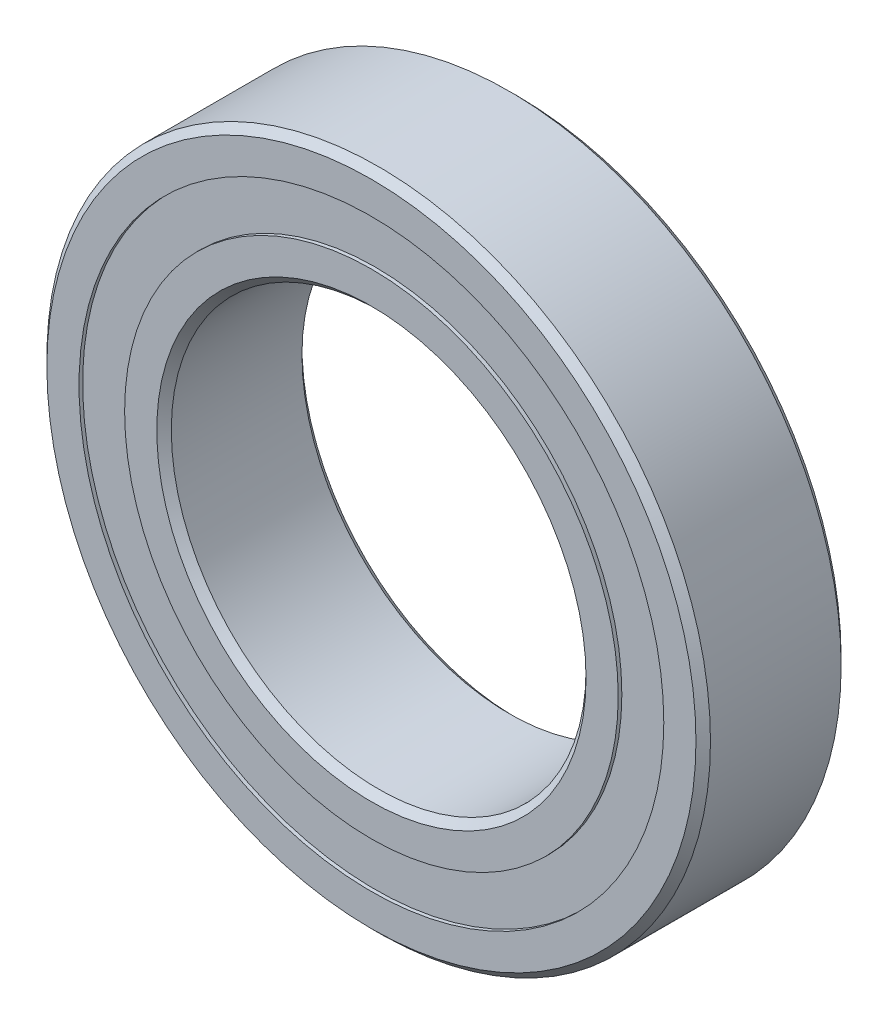
ISO-10303-21;
HEADER;
FILE_DESCRIPTION(('STEP AP214'),'2;1');
FILE_NAME('part.step','',(''),(''),'','','');
FILE_SCHEMA(('AUTOMOTIVE_DESIGN { 1 0 10303 214 1 1 1 1 }'));
ENDSEC;
DATA;
#1=APPLICATION_CONTEXT('core data for automotive mechanical design processes');
#2=APPLICATION_PROTOCOL_DEFINITION('international standard','automotive_design',2000,#1);
#3=PRODUCT_CONTEXT('',#1,'mechanical');
#4=PRODUCT('Part','Part','',(#3));
#5=PRODUCT_RELATED_PRODUCT_CATEGORY('part','',(#4));
#6=PRODUCT_DEFINITION_FORMATION('','',#4);
#7=PRODUCT_DEFINITION_CONTEXT('part definition',#1,'design');
#8=PRODUCT_DEFINITION('design','',#6,#7);
#9=PRODUCT_DEFINITION_SHAPE('','',#8);
#10=(LENGTH_UNIT() NAMED_UNIT(*) SI_UNIT(.MILLI.,.METRE.));
#11=(NAMED_UNIT(*) PLANE_ANGLE_UNIT() SI_UNIT($,.RADIAN.));
#12=(NAMED_UNIT(*) SI_UNIT($,.STERADIAN.) SOLID_ANGLE_UNIT());
#13=UNCERTAINTY_MEASURE_WITH_UNIT(LENGTH_MEASURE(1.E-05),#10,'distance_accuracy_value','');
#14=(GEOMETRIC_REPRESENTATION_CONTEXT(3) GLOBAL_UNCERTAINTY_ASSIGNED_CONTEXT((#13)) GLOBAL_UNIT_ASSIGNED_CONTEXT((#10,
#11,#12)) REPRESENTATION_CONTEXT('',''));
#15=CARTESIAN_POINT('',(0.,0.,0.));
#16=DIRECTION('',(0.,0.,1.));
#17=DIRECTION('',(1.,0.,0.));
#18=AXIS2_PLACEMENT_3D('',#15,#16,#17);
#19=CARTESIAN_POINT('',(0.,14.0989010989011,-3.325));
#20=DIRECTION('',(0.,0.,1.));
#21=DIRECTION('',(1.,0.,0.));
#22=AXIS2_PLACEMENT_3D('',#19,#20,#21);
#23=PLANE('',#22);
#24=CARTESIAN_POINT('',(0.,0.,-3.325));
#25=DIRECTION('',(0.,0.,1.));
#26=DIRECTION('',(1.,0.,0.));
#27=AXIS2_PLACEMENT_3D('',#24,#25,#26);
#28=CIRCLE('',#27,14.0989010989011);
#29=CARTESIAN_POINT('',(14.0989010989011,0.,-3.325));
#30=VERTEX_POINT('',#29);
#31=EDGE_CURVE('E59',#30,#30,#28,.T.);
#32=ORIENTED_EDGE('',*,*,#31,.F.);
#33=EDGE_LOOP('',(#32));
#34=FACE_BOUND('',#33,.T.);
#35=CARTESIAN_POINT('',(0.,0.,-3.325));
#36=DIRECTION('',(0.,0.,1.));
#37=DIRECTION('',(1.,0.,0.));
#38=AXIS2_PLACEMENT_3D('',#35,#36,#37);
#39=CIRCLE('',#38,11.9010989010989);
#40=CARTESIAN_POINT('',(11.9010989010989,0.,-3.325));
#41=VERTEX_POINT('',#40);
#42=EDGE_CURVE('E11',#41,#41,#39,.T.);
#43=ORIENTED_EDGE('',*,*,#42,.T.);
#44=EDGE_LOOP('',(#43));
#45=FACE_BOUND('',#44,.T.);
#46=ADVANCED_FACE('F45',(#34,#45),#23,.F.);
#47=CARTESIAN_POINT('',(0.,0.,3.5));
#48=DIRECTION('',(0.,0.,1.));
#49=DIRECTION('',(1.,0.,0.));
#50=AXIS2_PLACEMENT_3D('',#47,#48,#49);
#51=CYLINDRICAL_SURFACE('',#50,11.9010989010989);
#52=ORIENTED_EDGE('',*,*,#42,.F.);
#53=EDGE_LOOP('',(#52));
#54=FACE_BOUND('',#53,.T.);
#55=CARTESIAN_POINT('',(0.,0.,-1.90455682813241));
#56=DIRECTION('',(0.,0.,1.));
#57=DIRECTION('',(1.,0.,0.));
#58=AXIS2_PLACEMENT_3D('',#55,#56,#57);
#59=CIRCLE('',#58,11.9010989010989);
#60=CARTESIAN_POINT('',(11.9010989010989,0.,-1.90455682813241));
#61=VERTEX_POINT('',#60);
#62=EDGE_CURVE('E51',#61,#61,#59,.T.);
#63=ORIENTED_EDGE('',*,*,#62,.T.);
#64=EDGE_LOOP('',(#63));
#65=FACE_BOUND('',#64,.T.);
#66=ADVANCED_FACE('F68',(#54,#65),#51,.F.);
#67=CARTESIAN_POINT('',(0.,14.0989010989011,-1.90455682813241));
#68=DIRECTION('',(0.,0.,-1.));
#69=DIRECTION('',(-1.,0.,0.));
#70=AXIS2_PLACEMENT_3D('',#67,#68,#69);
#71=PLANE('',#70);
#72=ORIENTED_EDGE('',*,*,#62,.F.);
#73=EDGE_LOOP('',(#72));
#74=FACE_BOUND('',#73,.T.);
#75=CARTESIAN_POINT('',(0.,0.,-1.90455682813241));
#76=DIRECTION('',(0.,0.,1.));
#77=DIRECTION('',(1.,0.,0.));
#78=AXIS2_PLACEMENT_3D('',#75,#76,#77);
#79=CIRCLE('',#78,14.0989010989011);
#80=CARTESIAN_POINT('',(14.0989010989011,0.,-1.90455682813241));
#81=VERTEX_POINT('',#80);
#82=EDGE_CURVE('E55',#81,#81,#79,.T.);
#83=ORIENTED_EDGE('',*,*,#82,.T.);
#84=EDGE_LOOP('',(#83));
#85=FACE_BOUND('',#84,.T.);
#86=ADVANCED_FACE('F72',(#74,#85),#71,.F.);
#87=CARTESIAN_POINT('',(0.,0.,3.5));
#88=DIRECTION('',(0.,0.,1.));
#89=DIRECTION('',(1.,0.,0.));
#90=AXIS2_PLACEMENT_3D('',#87,#88,#89);
#91=CYLINDRICAL_SURFACE('',#90,14.0989010989011);
#92=ORIENTED_EDGE('',*,*,#82,.F.);
#93=EDGE_LOOP('',(#92));
#94=FACE_BOUND('',#93,.T.);
#95=ORIENTED_EDGE('',*,*,#31,.T.);
#96=EDGE_LOOP('',(#95));
#97=FACE_BOUND('',#96,.T.);
#98=ADVANCED_FACE('F65',(#94,#97),#91,.T.);
#99=CLOSED_SHELL('',(#46,#66,#86,#98));
#100=MANIFOLD_SOLID_BREP('B2',#99);
#101=CARTESIAN_POINT('',(0.,14.0989010989011,3.325));
#102=DIRECTION('',(0.,0.,-1.));
#103=DIRECTION('',(-1.,0.,0.));
#104=AXIS2_PLACEMENT_3D('',#101,#102,#103);
#105=PLANE('',#104);
#106=CARTESIAN_POINT('',(0.,0.,3.325));
#107=DIRECTION('',(0.,0.,1.));
#108=DIRECTION('',(1.,0.,0.));
#109=AXIS2_PLACEMENT_3D('',#106,#107,#108);
#110=CIRCLE('',#109,11.9010989010989);
#111=CARTESIAN_POINT('',(11.9010989010989,0.,3.325));
#112=VERTEX_POINT('',#111);
#113=EDGE_CURVE('E44',#112,#112,#110,.T.);
#114=ORIENTED_EDGE('',*,*,#113,.F.);
#115=EDGE_LOOP('',(#114));
#116=FACE_BOUND('',#115,.T.);
#117=CARTESIAN_POINT('',(0.,0.,3.325));
#118=DIRECTION('',(0.,0.,1.));
#119=DIRECTION('',(1.,0.,0.));
#120=AXIS2_PLACEMENT_3D('',#117,#118,#119);
#121=CIRCLE('',#120,14.0989010989011);
#122=CARTESIAN_POINT('',(14.0989010989011,0.,3.325));
#123=VERTEX_POINT('',#122);
#124=EDGE_CURVE('E126',#123,#123,#121,.T.);
#125=ORIENTED_EDGE('',*,*,#124,.T.);
#126=EDGE_LOOP('',(#125));
#127=FACE_BOUND('',#126,.T.);
#128=ADVANCED_FACE('F112',(#116,#127),#105,.F.);
#129=CARTESIAN_POINT('',(0.,0.,3.5));
#130=DIRECTION('',(0.,0.,1.));
#131=DIRECTION('',(1.,0.,0.));
#132=AXIS2_PLACEMENT_3D('',#129,#130,#131);
#133=CYLINDRICAL_SURFACE('',#132,11.9010989010989);
#134=CARTESIAN_POINT('',(0.,0.,1.90455682813241));
#135=DIRECTION('',(0.,0.,1.));
#136=DIRECTION('',(1.,0.,0.));
#137=AXIS2_PLACEMENT_3D('',#134,#135,#136);
#138=CIRCLE('',#137,11.9010989010989);
#139=CARTESIAN_POINT('',(11.9010989010989,0.,1.90455682813241));
#140=VERTEX_POINT('',#139);
#141=EDGE_CURVE('E118',#140,#140,#138,.T.);
#142=ORIENTED_EDGE('',*,*,#141,.F.);
#143=EDGE_LOOP('',(#142));
#144=FACE_BOUND('',#143,.T.);
#145=ORIENTED_EDGE('',*,*,#113,.T.);
#146=EDGE_LOOP('',(#145));
#147=FACE_BOUND('',#146,.T.);
#148=ADVANCED_FACE('F141',(#144,#147),#133,.F.);
#149=CARTESIAN_POINT('',(0.,14.0989010989011,1.90455682813241));
#150=DIRECTION('',(0.,0.,1.));
#151=DIRECTION('',(1.,0.,0.));
#152=AXIS2_PLACEMENT_3D('',#149,#150,#151);
#153=PLANE('',#152);
#154=CARTESIAN_POINT('',(0.,0.,1.90455682813241));
#155=DIRECTION('',(0.,0.,1.));
#156=DIRECTION('',(1.,0.,0.));
#157=AXIS2_PLACEMENT_3D('',#154,#155,#156);
#158=CIRCLE('',#157,14.0989010989011);
#159=CARTESIAN_POINT('',(14.0989010989011,0.,1.90455682813241));
#160=VERTEX_POINT('',#159);
#161=EDGE_CURVE('E122',#160,#160,#158,.T.);
#162=ORIENTED_EDGE('',*,*,#161,.F.);
#163=EDGE_LOOP('',(#162));
#164=FACE_BOUND('',#163,.T.);
#165=ORIENTED_EDGE('',*,*,#141,.T.);
#166=EDGE_LOOP('',(#165));
#167=FACE_BOUND('',#166,.T.);
#168=ADVANCED_FACE('F136',(#164,#167),#153,.F.);
#169=CARTESIAN_POINT('',(0.,0.,3.5));
#170=DIRECTION('',(0.,0.,1.));
#171=DIRECTION('',(1.,0.,0.));
#172=AXIS2_PLACEMENT_3D('',#169,#170,#171);
#173=CYLINDRICAL_SURFACE('',#172,14.0989010989011);
#174=ORIENTED_EDGE('',*,*,#124,.F.);
#175=EDGE_LOOP('',(#174));
#176=FACE_BOUND('',#175,.T.);
#177=ORIENTED_EDGE('',*,*,#161,.T.);
#178=EDGE_LOOP('',(#177));
#179=FACE_BOUND('',#178,.T.);
#180=ADVANCED_FACE('F133',(#176,#179),#173,.T.);
#181=CLOSED_SHELL('',(#128,#148,#168,#180));
#182=MANIFOLD_SOLID_BREP('B6',#181);
#183=CARTESIAN_POINT('',(-6.49999999999986,11.2583302491978,0.));
#184=DIRECTION('',(0.,0.,1.));
#185=DIRECTION('',(-0.499999999999989,0.866025403784445,0.));
#186=AXIS2_PLACEMENT_3D('',#183,#184,#185);
#187=SPHERICAL_SURFACE('',#186,1.90455682813241);
#188=CARTESIAN_POINT('',(-6.49999999999986,11.2583302491978,1.90455682813241));
#189=VERTEX_POINT('',#188);
#190=VERTEX_LOOP('',#189);
#191=FACE_BOUND('',#190,.T.);
#192=ADVANCED_FACE('F179',(#191),#187,.T.);
#193=CLOSED_SHELL('',(#192));
#194=MANIFOLD_SOLID_BREP('B39',#193);
#195=CARTESIAN_POINT('',(-11.2583302491976,6.50000000000013,0.));
#196=DIRECTION('',(0.,0.,1.));
#197=DIRECTION('',(-0.866025403784433,0.50000000000001,0.));
#198=AXIS2_PLACEMENT_3D('',#195,#196,#197);
#199=SPHERICAL_SURFACE('',#198,1.90455682813241);
#200=CARTESIAN_POINT('',(-11.2583302491976,6.50000000000013,1.90455682813241));
#201=VERTEX_POINT('',#200);
#202=VERTEX_LOOP('',#201);
#203=FACE_BOUND('',#202,.T.);
#204=ADVANCED_FACE('F199',(#203),#199,.T.);
#205=CLOSED_SHELL('',(#204));
#206=MANIFOLD_SOLID_BREP('B108',#205);
#207=CARTESIAN_POINT('',(-13.,1.36167772214882E-13,0.));
#208=DIRECTION('',(0.,0.,1.));
#209=DIRECTION('',(-1.,0.,0.));
#210=AXIS2_PLACEMENT_3D('',#207,#208,#209);
#211=SPHERICAL_SURFACE('',#210,1.90455682813241);
#212=CARTESIAN_POINT('',(-13.,1.36167772214882E-13,1.90455682813241));
#213=VERTEX_POINT('',#212);
#214=VERTEX_LOOP('',#213);
#215=FACE_BOUND('',#214,.T.);
#216=ADVANCED_FACE('F219',(#215),#211,.T.);
#217=CLOSED_SHELL('',(#216));
#218=MANIFOLD_SOLID_BREP('B175',#217);
#219=CARTESIAN_POINT('',(-11.2583302491978,-6.4999999999999,0.));
#220=DIRECTION('',(0.,0.,1.));
#221=DIRECTION('',(-0.866025403784443,-0.499999999999992,0.));
#222=AXIS2_PLACEMENT_3D('',#219,#220,#221);
#223=SPHERICAL_SURFACE('',#222,1.90455682813241);
#224=CARTESIAN_POINT('',(-11.2583302491978,-6.4999999999999,1.90455682813241));
#225=VERTEX_POINT('',#224);
#226=VERTEX_LOOP('',#225);
#227=FACE_BOUND('',#226,.T.);
#228=ADVANCED_FACE('F239',(#227),#223,.T.);
#229=CLOSED_SHELL('',(#228));
#230=MANIFOLD_SOLID_BREP('B195',#229);
#231=CARTESIAN_POINT('',(-6.50000000000009,-11.2583302491977,0.));
#232=DIRECTION('',(0.,0.,1.));
#233=DIRECTION('',(-0.500000000000007,-0.866025403784435,0.));
#234=AXIS2_PLACEMENT_3D('',#231,#232,#233);
#235=SPHERICAL_SURFACE('',#234,1.90455682813241);
#236=CARTESIAN_POINT('',(-6.50000000000009,-11.2583302491977,1.90455682813241));
#237=VERTEX_POINT('',#236);
#238=VERTEX_LOOP('',#237);
#239=FACE_BOUND('',#238,.T.);
#240=ADVANCED_FACE('F259',(#239),#235,.T.);
#241=CLOSED_SHELL('',(#240));
#242=MANIFOLD_SOLID_BREP('B215',#241);
#243=CARTESIAN_POINT('',(0.,-13.,0.));
#244=DIRECTION('',(0.,0.,1.));
#245=DIRECTION('',(0.,-1.,0.));
#246=AXIS2_PLACEMENT_3D('',#243,#244,#245);
#247=SPHERICAL_SURFACE('',#246,1.90455682813241);
#248=CARTESIAN_POINT('',(0.,-13.,1.90455682813241));
#249=VERTEX_POINT('',#248);
#250=VERTEX_LOOP('',#249);
#251=FACE_BOUND('',#250,.T.);
#252=ADVANCED_FACE('F279',(#251),#247,.T.);
#253=CLOSED_SHELL('',(#252));
#254=MANIFOLD_SOLID_BREP('B235',#253);
#255=CARTESIAN_POINT('',(6.49999999999993,-11.2583302491977,0.));
#256=DIRECTION('',(0.,0.,1.));
#257=DIRECTION('',(0.499999999999995,-0.866025403784442,0.));
#258=AXIS2_PLACEMENT_3D('',#255,#256,#257);
#259=SPHERICAL_SURFACE('',#258,1.90455682813241);
#260=CARTESIAN_POINT('',(6.49999999999993,-11.2583302491977,1.90455682813241));
#261=VERTEX_POINT('',#260);
#262=VERTEX_LOOP('',#261);
#263=FACE_BOUND('',#262,.T.);
#264=ADVANCED_FACE('F299',(#263),#259,.T.);
#265=CLOSED_SHELL('',(#264));
#266=MANIFOLD_SOLID_BREP('B255',#265);
#267=CARTESIAN_POINT('',(11.2583302491977,-6.50000000000005,0.));
#268=DIRECTION('',(0.,0.,1.));
#269=DIRECTION('',(0.866025403784436,-0.500000000000004,0.));
#270=AXIS2_PLACEMENT_3D('',#267,#268,#269);
#271=SPHERICAL_SURFACE('',#270,1.90455682813241);
#272=CARTESIAN_POINT('',(11.2583302491977,-6.50000000000005,1.90455682813241));
#273=VERTEX_POINT('',#272);
#274=VERTEX_LOOP('',#273);
#275=FACE_BOUND('',#274,.T.);
#276=ADVANCED_FACE('F319',(#275),#271,.T.);
#277=CLOSED_SHELL('',(#276));
#278=MANIFOLD_SOLID_BREP('B275',#277);
#279=CARTESIAN_POINT('',(13.,0.,0.));
#280=DIRECTION('',(0.,0.,1.));
#281=DIRECTION('',(1.,0.,0.));
#282=AXIS2_PLACEMENT_3D('',#279,#280,#281);
#283=SPHERICAL_SURFACE('',#282,1.90455682813241);
#284=CARTESIAN_POINT('',(13.,0.,1.90455682813241));
#285=VERTEX_POINT('',#284);
#286=VERTEX_LOOP('',#285);
#287=FACE_BOUND('',#286,.T.);
#288=ADVANCED_FACE('F339',(#287),#283,.T.);
#289=CLOSED_SHELL('',(#288));
#290=MANIFOLD_SOLID_BREP('B295',#289);
#291=CARTESIAN_POINT('',(11.2583302491977,6.49999999999997,0.));
#292=DIRECTION('',(0.,0.,1.));
#293=DIRECTION('',(0.86602540378444,0.499999999999998,0.));
#294=AXIS2_PLACEMENT_3D('',#291,#292,#293);
#295=SPHERICAL_SURFACE('',#294,1.90455682813241);
#296=CARTESIAN_POINT('',(11.2583302491977,6.49999999999997,1.90455682813241));
#297=VERTEX_POINT('',#296);
#298=VERTEX_LOOP('',#297);
#299=FACE_BOUND('',#298,.T.);
#300=ADVANCED_FACE('F359',(#299),#295,.T.);
#301=CLOSED_SHELL('',(#300));
#302=MANIFOLD_SOLID_BREP('B315',#301);
#303=CARTESIAN_POINT('',(6.50000000000001,11.2583302491977,0.));
#304=DIRECTION('',(0.,0.,1.));
#305=DIRECTION('',(0.500000000000001,0.866025403784438,0.));
#306=AXIS2_PLACEMENT_3D('',#303,#304,#305);
#307=SPHERICAL_SURFACE('',#306,1.90455682813241);
#308=CARTESIAN_POINT('',(6.50000000000001,11.2583302491977,1.90455682813241));
#309=VERTEX_POINT('',#308);
#310=VERTEX_LOOP('',#309);
#311=FACE_BOUND('',#310,.T.);
#312=ADVANCED_FACE('F379',(#311),#307,.T.);
#313=CLOSED_SHELL('',(#312));
#314=MANIFOLD_SOLID_BREP('B335',#313);
#315=CARTESIAN_POINT('',(0.,13.,0.));
#316=DIRECTION('',(0.,0.,1.));
#317=DIRECTION('',(0.,1.,0.));
#318=AXIS2_PLACEMENT_3D('',#315,#316,#317);
#319=SPHERICAL_SURFACE('',#318,1.90455682813241);
#320=CARTESIAN_POINT('',(0.,13.,1.90455682813241));
#321=VERTEX_POINT('',#320);
#322=VERTEX_LOOP('',#321);
#323=FACE_BOUND('',#322,.T.);
#324=ADVANCED_FACE('F401',(#323),#319,.T.);
#325=CLOSED_SHELL('',(#324));
#326=MANIFOLD_SOLID_BREP('B355',#325);
#327=CARTESIAN_POINT('',(0.,11.9010989010989,3.5));
#328=DIRECTION('',(0.,0.,-1.));
#329=DIRECTION('',(-1.,0.,0.));
#330=AXIS2_PLACEMENT_3D('',#327,#328,#329);
#331=PLANE('',#330);
#332=CARTESIAN_POINT('',(0.,0.,3.5));
#333=DIRECTION('',(0.,0.,1.));
#334=DIRECTION('',(1.,0.,0.));
#335=AXIS2_PLACEMENT_3D('',#332,#333,#334);
#336=CIRCLE('',#335,10.35);
#337=CARTESIAN_POINT('',(10.35,0.,3.5));
#338=VERTEX_POINT('',#337);
#339=EDGE_CURVE('E448',#338,#338,#336,.T.);
#340=ORIENTED_EDGE('',*,*,#339,.F.);
#341=EDGE_LOOP('',(#340));
#342=FACE_BOUND('',#341,.T.);
#343=CARTESIAN_POINT('',(0.,0.,3.5));
#344=DIRECTION('',(0.,0.,1.));
#345=DIRECTION('',(1.,0.,0.));
#346=AXIS2_PLACEMENT_3D('',#343,#344,#345);
#347=CIRCLE('',#346,11.9010989010989);
#348=CARTESIAN_POINT('',(11.9010989010989,0.,3.5));
#349=VERTEX_POINT('',#348);
#350=EDGE_CURVE('E400',#349,#349,#347,.T.);
#351=ORIENTED_EDGE('',*,*,#350,.T.);
#352=EDGE_LOOP('',(#351));
#353=FACE_BOUND('',#352,.T.);
#354=ADVANCED_FACE('F420',(#342,#353),#331,.F.);
#355=CARTESIAN_POINT('',(0.,0.,3.5));
#356=DIRECTION('',(0.,0.,1.));
#357=DIRECTION('',(1.,0.,0.));
#358=AXIS2_PLACEMENT_3D('',#355,#356,#357);
#359=CYLINDRICAL_SURFACE('',#358,11.9010989010989);
#360=ORIENTED_EDGE('',*,*,#350,.F.);
#361=EDGE_LOOP('',(#360));
#362=FACE_BOUND('',#361,.T.);
#363=CARTESIAN_POINT('',(0.,0.,1.55555555555555));
#364=DIRECTION('',(0.,0.,1.));
#365=DIRECTION('',(1.,0.,0.));
#366=AXIS2_PLACEMENT_3D('',#363,#364,#365);
#367=CIRCLE('',#366,11.9010989010989);
#368=CARTESIAN_POINT('',(11.9010989010989,0.,1.55555555555555));
#369=VERTEX_POINT('',#368);
#370=EDGE_CURVE('E426',#369,#369,#367,.T.);
#371=ORIENTED_EDGE('',*,*,#370,.T.);
#372=EDGE_LOOP('',(#371));
#373=FACE_BOUND('',#372,.T.);
#374=ADVANCED_FACE('F455',(#362,#373),#359,.T.);
#375=CARTESIAN_POINT('',(0.,0.,0.));
#376=DIRECTION('',(0.,0.,1.));
#377=DIRECTION('',(1.,0.,0.));
#378=AXIS2_PLACEMENT_3D('',#375,#376,#377);
#379=TOROIDAL_SURFACE('',#378,13.,1.90455682813241);
#380=ORIENTED_EDGE('',*,*,#370,.F.);
#381=EDGE_LOOP('',(#380));
#382=FACE_BOUND('',#381,.T.);
#383=CARTESIAN_POINT('',(0.,0.,-1.55555555555556));
#384=DIRECTION('',(0.,0.,1.));
#385=DIRECTION('',(1.,0.,0.));
#386=AXIS2_PLACEMENT_3D('',#383,#384,#385);
#387=CIRCLE('',#386,11.9010989010989);
#388=CARTESIAN_POINT('',(11.9010989010989,0.,-1.55555555555556));
#389=VERTEX_POINT('',#388);
#390=EDGE_CURVE('E430',#389,#389,#387,.T.);
#391=ORIENTED_EDGE('',*,*,#390,.T.);
#392=EDGE_LOOP('',(#391));
#393=FACE_BOUND('',#392,.T.);
#394=ADVANCED_FACE('F459',(#382,#393),#379,.F.);
#395=CARTESIAN_POINT('',(0.,0.,3.5));
#396=DIRECTION('',(0.,0.,1.));
#397=DIRECTION('',(1.,0.,0.));
#398=AXIS2_PLACEMENT_3D('',#395,#396,#397);
#399=CYLINDRICAL_SURFACE('',#398,11.9010989010989);
#400=ORIENTED_EDGE('',*,*,#390,.F.);
#401=EDGE_LOOP('',(#400));
#402=FACE_BOUND('',#401,.T.);
#403=CARTESIAN_POINT('',(0.,0.,-3.5));
#404=DIRECTION('',(0.,0.,1.));
#405=DIRECTION('',(1.,0.,0.));
#406=AXIS2_PLACEMENT_3D('',#403,#404,#405);
#407=CIRCLE('',#406,11.9010989010989);
#408=CARTESIAN_POINT('',(11.9010989010989,0.,-3.5));
#409=VERTEX_POINT('',#408);
#410=EDGE_CURVE('E434',#409,#409,#407,.T.);
#411=ORIENTED_EDGE('',*,*,#410,.T.);
#412=EDGE_LOOP('',(#411));
#413=FACE_BOUND('',#412,.T.);
#414=ADVANCED_FACE('F464',(#402,#413),#399,.T.);
#415=CARTESIAN_POINT('',(0.,10.35,-3.5));
#416=DIRECTION('',(0.,0.,1.));
#417=DIRECTION('',(1.,0.,0.));
#418=AXIS2_PLACEMENT_3D('',#415,#416,#417);
#419=PLANE('',#418);
#420=ORIENTED_EDGE('',*,*,#410,.F.);
#421=EDGE_LOOP('',(#420));
#422=FACE_BOUND('',#421,.T.);
#423=CARTESIAN_POINT('',(0.,0.,-3.5));
#424=DIRECTION('',(0.,0.,1.));
#425=DIRECTION('',(1.,0.,0.));
#426=AXIS2_PLACEMENT_3D('',#423,#424,#425);
#427=CIRCLE('',#426,10.35);
#428=CARTESIAN_POINT('',(10.35,0.,-3.5));
#429=VERTEX_POINT('',#428);
#430=EDGE_CURVE('E439',#429,#429,#427,.T.);
#431=ORIENTED_EDGE('',*,*,#430,.T.);
#432=EDGE_LOOP('',(#431));
#433=FACE_BOUND('',#432,.T.);
#434=ADVANCED_FACE('F470',(#422,#433),#419,.F.);
#435=CARTESIAN_POINT('',(0.,0.,-3.15));
#436=DIRECTION('',(0.,0.,-1.));
#437=DIRECTION('',(-1.,0.,0.));
#438=AXIS2_PLACEMENT_3D('',#435,#436,#437);
#439=CONICAL_SURFACE('',#438,10.,0.785398163397446);
#440=ORIENTED_EDGE('',*,*,#430,.F.);
#441=EDGE_LOOP('',(#440));
#442=FACE_BOUND('',#441,.T.);
#443=CARTESIAN_POINT('',(0.,0.,-3.15));
#444=DIRECTION('',(0.,0.,1.));
#445=DIRECTION('',(1.,0.,0.));
#446=AXIS2_PLACEMENT_3D('',#443,#444,#445);
#447=CIRCLE('',#446,10.);
#448=CARTESIAN_POINT('',(10.,0.,-3.15));
#449=VERTEX_POINT('',#448);
#450=EDGE_CURVE('E442',#449,#449,#447,.T.);
#451=ORIENTED_EDGE('',*,*,#450,.T.);
#452=EDGE_LOOP('',(#451));
#453=FACE_BOUND('',#452,.T.);
#454=ADVANCED_FACE('F474',(#442,#453),#439,.F.);
#455=CARTESIAN_POINT('',(0.,0.,3.5));
#456=DIRECTION('',(0.,0.,1.));
#457=DIRECTION('',(1.,0.,0.));
#458=AXIS2_PLACEMENT_3D('',#455,#456,#457);
#459=CYLINDRICAL_SURFACE('',#458,10.);
#460=ORIENTED_EDGE('',*,*,#450,.F.);
#461=EDGE_LOOP('',(#460));
#462=FACE_BOUND('',#461,.T.);
#463=CARTESIAN_POINT('',(0.,0.,3.15));
#464=DIRECTION('',(0.,0.,1.));
#465=DIRECTION('',(1.,0.,0.));
#466=AXIS2_PLACEMENT_3D('',#463,#464,#465);
#467=CIRCLE('',#466,10.);
#468=CARTESIAN_POINT('',(10.,0.,3.15));
#469=VERTEX_POINT('',#468);
#470=EDGE_CURVE('E445',#469,#469,#467,.T.);
#471=ORIENTED_EDGE('',*,*,#470,.T.);
#472=EDGE_LOOP('',(#471));
#473=FACE_BOUND('',#472,.T.);
#474=ADVANCED_FACE('F478',(#462,#473),#459,.F.);
#475=CARTESIAN_POINT('',(0.,0.,3.5));
#476=DIRECTION('',(0.,0.,1.));
#477=DIRECTION('',(1.,0.,0.));
#478=AXIS2_PLACEMENT_3D('',#475,#476,#477);
#479=CONICAL_SURFACE('',#478,10.35,0.785398163397453);
#480=ORIENTED_EDGE('',*,*,#470,.F.);
#481=EDGE_LOOP('',(#480));
#482=FACE_BOUND('',#481,.T.);
#483=ORIENTED_EDGE('',*,*,#339,.T.);
#484=EDGE_LOOP('',(#483));
#485=FACE_BOUND('',#484,.T.);
#486=ADVANCED_FACE('F452',(#482,#485),#479,.F.);
#487=CLOSED_SHELL('',(#354,#374,#394,#414,#434,#454,#474,#486));
#488=MANIFOLD_SOLID_BREP('B375',#487);
#489=CARTESIAN_POINT('',(0.,0.,3.15));
#490=DIRECTION('',(0.,0.,-1.));
#491=DIRECTION('',(-1.,0.,0.));
#492=AXIS2_PLACEMENT_3D('',#489,#490,#491);
#493=CONICAL_SURFACE('',#492,16.,0.785398163397448);
#494=CARTESIAN_POINT('',(0.,0.,3.5));
#495=DIRECTION('',(0.,0.,1.));
#496=DIRECTION('',(1.,0.,0.));
#497=AXIS2_PLACEMENT_3D('',#494,#495,#496);
#498=CIRCLE('',#497,15.65);
#499=CARTESIAN_POINT('',(15.65,0.,3.5));
#500=VERTEX_POINT('',#499);
#501=EDGE_CURVE('E569',#500,#500,#498,.T.);
#502=ORIENTED_EDGE('',*,*,#501,.F.);
#503=EDGE_LOOP('',(#502));
#504=FACE_BOUND('',#503,.T.);
#505=CARTESIAN_POINT('',(0.,0.,3.15));
#506=DIRECTION('',(0.,0.,1.));
#507=DIRECTION('',(1.,0.,0.));
#508=AXIS2_PLACEMENT_3D('',#505,#506,#507);
#509=CIRCLE('',#508,16.);
#510=CARTESIAN_POINT('',(16.,0.,3.15));
#511=VERTEX_POINT('',#510);
#512=EDGE_CURVE('E419',#511,#511,#509,.T.);
#513=ORIENTED_EDGE('',*,*,#512,.T.);
#514=EDGE_LOOP('',(#513));
#515=FACE_BOUND('',#514,.T.);
#516=ADVANCED_FACE('F541',(#504,#515),#493,.T.);
#517=CARTESIAN_POINT('',(0.,0.,3.5));
#518=DIRECTION('',(0.,0.,1.));
#519=DIRECTION('',(1.,0.,0.));
#520=AXIS2_PLACEMENT_3D('',#517,#518,#519);
#521=CYLINDRICAL_SURFACE('',#520,16.);
#522=ORIENTED_EDGE('',*,*,#512,.F.);
#523=EDGE_LOOP('',(#522));
#524=FACE_BOUND('',#523,.T.);
#525=CARTESIAN_POINT('',(0.,0.,-3.15));
#526=DIRECTION('',(0.,0.,1.));
#527=DIRECTION('',(1.,0.,0.));
#528=AXIS2_PLACEMENT_3D('',#525,#526,#527);
#529=CIRCLE('',#528,16.);
#530=CARTESIAN_POINT('',(16.,0.,-3.15));
#531=VERTEX_POINT('',#530);
#532=EDGE_CURVE('E547',#531,#531,#529,.T.);
#533=ORIENTED_EDGE('',*,*,#532,.T.);
#534=EDGE_LOOP('',(#533));
#535=FACE_BOUND('',#534,.T.);
#536=ADVANCED_FACE('F576',(#524,#535),#521,.T.);
#537=CARTESIAN_POINT('',(0.,0.,-3.5));
#538=DIRECTION('',(0.,0.,1.));
#539=DIRECTION('',(1.,0.,0.));
#540=AXIS2_PLACEMENT_3D('',#537,#538,#539);
#541=CONICAL_SURFACE('',#540,15.65,0.785398163397446);
#542=ORIENTED_EDGE('',*,*,#532,.F.);
#543=EDGE_LOOP('',(#542));
#544=FACE_BOUND('',#543,.T.);
#545=CARTESIAN_POINT('',(0.,0.,-3.5));
#546=DIRECTION('',(0.,0.,1.));
#547=DIRECTION('',(1.,0.,0.));
#548=AXIS2_PLACEMENT_3D('',#545,#546,#547);
#549=CIRCLE('',#548,15.65);
#550=CARTESIAN_POINT('',(15.65,0.,-3.5));
#551=VERTEX_POINT('',#550);
#552=EDGE_CURVE('E551',#551,#551,#549,.T.);
#553=ORIENTED_EDGE('',*,*,#552,.T.);
#554=EDGE_LOOP('',(#553));
#555=FACE_BOUND('',#554,.T.);
#556=ADVANCED_FACE('F580',(#544,#555),#541,.T.);
#557=CARTESIAN_POINT('',(0.,15.65,-3.5));
#558=DIRECTION('',(0.,0.,1.));
#559=DIRECTION('',(1.,0.,0.));
#560=AXIS2_PLACEMENT_3D('',#557,#558,#559);
#561=PLANE('',#560);
#562=ORIENTED_EDGE('',*,*,#552,.F.);
#563=EDGE_LOOP('',(#562));
#564=FACE_BOUND('',#563,.T.);
#565=CARTESIAN_POINT('',(0.,0.,-3.5));
#566=DIRECTION('',(0.,0.,1.));
#567=DIRECTION('',(1.,0.,0.));
#568=AXIS2_PLACEMENT_3D('',#565,#566,#567);
#569=CIRCLE('',#568,14.0989010989011);
#570=CARTESIAN_POINT('',(14.0989010989011,0.,-3.5));
#571=VERTEX_POINT('',#570);
#572=EDGE_CURVE('E555',#571,#571,#569,.T.);
#573=ORIENTED_EDGE('',*,*,#572,.T.);
#574=EDGE_LOOP('',(#573));
#575=FACE_BOUND('',#574,.T.);
#576=ADVANCED_FACE('F585',(#564,#575),#561,.F.);
#577=CARTESIAN_POINT('',(0.,0.,3.5));
#578=DIRECTION('',(0.,0.,1.));
#579=DIRECTION('',(1.,0.,0.));
#580=AXIS2_PLACEMENT_3D('',#577,#578,#579);
#581=CYLINDRICAL_SURFACE('',#580,14.0989010989011);
#582=ORIENTED_EDGE('',*,*,#572,.F.);
#583=EDGE_LOOP('',(#582));
#584=FACE_BOUND('',#583,.T.);
#585=CARTESIAN_POINT('',(0.,0.,-1.55555555555556));
#586=DIRECTION('',(0.,0.,1.));
#587=DIRECTION('',(1.,0.,0.));
#588=AXIS2_PLACEMENT_3D('',#585,#586,#587);
#589=CIRCLE('',#588,14.0989010989011);
#590=CARTESIAN_POINT('',(14.0989010989011,0.,-1.55555555555556));
#591=VERTEX_POINT('',#590);
#592=EDGE_CURVE('E560',#591,#591,#589,.T.);
#593=ORIENTED_EDGE('',*,*,#592,.T.);
#594=EDGE_LOOP('',(#593));
#595=FACE_BOUND('',#594,.T.);
#596=ADVANCED_FACE('F591',(#584,#595),#581,.F.);
#597=CARTESIAN_POINT('',(0.,0.,0.));
#598=DIRECTION('',(0.,0.,1.));
#599=DIRECTION('',(1.,0.,0.));
#600=AXIS2_PLACEMENT_3D('',#597,#598,#599);
#601=TOROIDAL_SURFACE('',#600,13.,1.90455682813241);
#602=ORIENTED_EDGE('',*,*,#592,.F.);
#603=EDGE_LOOP('',(#602));
#604=FACE_BOUND('',#603,.T.);
#605=CARTESIAN_POINT('',(0.,0.,1.55555555555555));
#606=DIRECTION('',(0.,0.,1.));
#607=DIRECTION('',(1.,0.,0.));
#608=AXIS2_PLACEMENT_3D('',#605,#606,#607);
#609=CIRCLE('',#608,14.0989010989011);
#610=CARTESIAN_POINT('',(14.0989010989011,0.,1.55555555555555));
#611=VERTEX_POINT('',#610);
#612=EDGE_CURVE('E563',#611,#611,#609,.T.);
#613=ORIENTED_EDGE('',*,*,#612,.T.);
#614=EDGE_LOOP('',(#613));
#615=FACE_BOUND('',#614,.T.);
#616=ADVANCED_FACE('F595',(#604,#615),#601,.F.);
#617=CARTESIAN_POINT('',(0.,0.,3.5));
#618=DIRECTION('',(0.,0.,1.));
#619=DIRECTION('',(1.,0.,0.));
#620=AXIS2_PLACEMENT_3D('',#617,#618,#619);
#621=CYLINDRICAL_SURFACE('',#620,14.0989010989011);
#622=ORIENTED_EDGE('',*,*,#612,.F.);
#623=EDGE_LOOP('',(#622));
#624=FACE_BOUND('',#623,.T.);
#625=CARTESIAN_POINT('',(0.,0.,3.5));
#626=DIRECTION('',(0.,0.,1.));
#627=DIRECTION('',(1.,0.,0.));
#628=AXIS2_PLACEMENT_3D('',#625,#626,#627);
#629=CIRCLE('',#628,14.0989010989011);
#630=CARTESIAN_POINT('',(14.0989010989011,0.,3.5));
#631=VERTEX_POINT('',#630);
#632=EDGE_CURVE('E566',#631,#631,#629,.T.);
#633=ORIENTED_EDGE('',*,*,#632,.T.);
#634=EDGE_LOOP('',(#633));
#635=FACE_BOUND('',#634,.T.);
#636=ADVANCED_FACE('F599',(#624,#635),#621,.F.);
#637=CARTESIAN_POINT('',(0.,15.65,3.5));
#638=DIRECTION('',(0.,0.,-1.));
#639=DIRECTION('',(-1.,0.,0.));
#640=AXIS2_PLACEMENT_3D('',#637,#638,#639);
#641=PLANE('',#640);
#642=ORIENTED_EDGE('',*,*,#632,.F.);
#643=EDGE_LOOP('',(#642));
#644=FACE_BOUND('',#643,.T.);
#645=ORIENTED_EDGE('',*,*,#501,.T.);
#646=EDGE_LOOP('',(#645));
#647=FACE_BOUND('',#646,.T.);
#648=ADVANCED_FACE('F573',(#644,#647),#641,.F.);
#649=CLOSED_SHELL('',(#516,#536,#556,#576,#596,#616,#636,#648));
#650=MANIFOLD_SOLID_BREP('B395',#649);
#651=ADVANCED_BREP_SHAPE_REPRESENTATION('',(#18,#100,#182,#194,#206,#218,#230,#242,#254,#266,
#278,#290,#302,#314,#326,#488,#650),#14);
#652=SHAPE_DEFINITION_REPRESENTATION(#9,#651);
ENDSEC;
END-ISO-10303-21;
